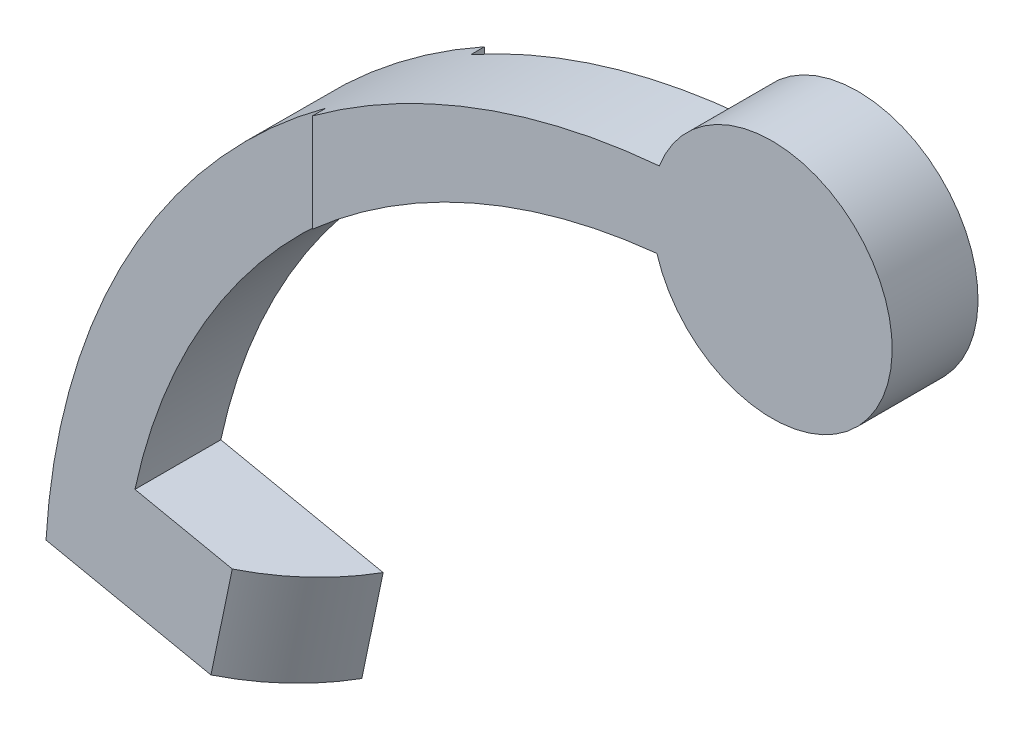
ISO-10303-21;
HEADER;
FILE_DESCRIPTION(('STEP AP214'),'2;1');
FILE_NAME('part.step','',(''),(''),'','','');
FILE_SCHEMA(('AUTOMOTIVE_DESIGN { 1 0 10303 214 1 1 1 1 }'));
ENDSEC;
DATA;
#1=APPLICATION_CONTEXT('core data for automotive mechanical design processes');
#2=APPLICATION_PROTOCOL_DEFINITION('international standard','automotive_design',2000,#1);
#3=PRODUCT_CONTEXT('',#1,'mechanical');
#4=PRODUCT('Part','Part','',(#3));
#5=PRODUCT_RELATED_PRODUCT_CATEGORY('part','',(#4));
#6=PRODUCT_DEFINITION_FORMATION('','',#4);
#7=PRODUCT_DEFINITION_CONTEXT('part definition',#1,'design');
#8=PRODUCT_DEFINITION('design','',#6,#7);
#9=PRODUCT_DEFINITION_SHAPE('','',#8);
#10=(LENGTH_UNIT() NAMED_UNIT(*) SI_UNIT(.MILLI.,.METRE.));
#11=(NAMED_UNIT(*) PLANE_ANGLE_UNIT() SI_UNIT($,.RADIAN.));
#12=(NAMED_UNIT(*) SI_UNIT($,.STERADIAN.) SOLID_ANGLE_UNIT());
#13=UNCERTAINTY_MEASURE_WITH_UNIT(LENGTH_MEASURE(1.E-05),#10,'distance_accuracy_value','');
#14=(GEOMETRIC_REPRESENTATION_CONTEXT(3) GLOBAL_UNCERTAINTY_ASSIGNED_CONTEXT((#13)) GLOBAL_UNIT_ASSIGNED_CONTEXT((#10,
#11,#12)) REPRESENTATION_CONTEXT('',''));
#15=CARTESIAN_POINT('',(0.,0.,0.));
#16=DIRECTION('',(0.,0.,1.));
#17=DIRECTION('',(1.,0.,0.));
#18=AXIS2_PLACEMENT_3D('',#15,#16,#17);
#19=CARTESIAN_POINT('',(-7.54083786418247,-36.2290461115529,45.));
#20=DIRECTION('',(-0.203776064234001,-0.979017525708963,0.));
#21=DIRECTION('',(0.979017525708963,-0.203776064234001,0.));
#22=AXIS2_PLACEMENT_3D('',#19,#20,#21);
#23=PLANE('',#22);
#24=CARTESIAN_POINT('',(-40.2891880374503,-29.4126922330737,-6.16529059894186));
#25=DIRECTION('',(0.203776064234001,0.979017525708963,0.));
#26=DIRECTION('',(-0.979017525708963,0.203776064234001,0.));
#27=AXIS2_PLACEMENT_3D('',#24,#25,#26);
#28=CIRCLE('',#27,13.2527069667015);
#29=CARTESIAN_POINT('',(-32.2142156380667,-31.0934446722632,4.20795064633006));
#30=VERTEX_POINT('',#29);
#31=CARTESIAN_POINT('',(-28.4288232400276,-31.8813492237114,-0.792049353669941));
#32=VERTEX_POINT('',#31);
#33=EDGE_CURVE('E49',#30,#32,#28,.T.);
#34=ORIENTED_EDGE('',*,*,#33,.T.);
#35=DIRECTION('',(0.979017525708963,-0.203776064234001,0.));
#36=VECTOR('',#35,1.);
#37=CARTESIAN_POINT('',(-7.54083786418247,-36.2290461115529,-0.792049353669944));
#38=LINE('',#37,#36);
#39=CARTESIAN_POINT('',(-37.8809726052462,-29.9139464493828,-0.792049353669944));
#40=VERTEX_POINT('',#39);
#41=EDGE_CURVE('E150',#40,#32,#38,.T.);
#42=ORIENTED_EDGE('',*,*,#41,.F.);
#43=DIRECTION('',(0.,0.,-1.));
#44=VECTOR('',#43,1.);
#45=CARTESIAN_POINT('',(-37.8809726052462,-29.9139464493828,45.));
#46=LINE('',#45,#44);
#47=CARTESIAN_POINT('',(-37.8809726052462,-29.9139464493828,4.20795064633006));
#48=VERTEX_POINT('',#47);
#49=EDGE_CURVE('E167',#48,#40,#46,.T.);
#50=ORIENTED_EDGE('',*,*,#49,.F.);
#51=DIRECTION('',(0.979017525708963,-0.203776064234001,0.));
#52=VECTOR('',#51,1.);
#53=CARTESIAN_POINT('',(-7.54083786418247,-36.2290461115529,4.20795064633006));
#54=LINE('',#53,#52);
#55=EDGE_CURVE('E139',#48,#30,#54,.T.);
#56=ORIENTED_EDGE('',*,*,#55,.T.);
#57=EDGE_LOOP('',(#34,#42,#50,#56));
#58=FACE_BOUND('',#57,.T.);
#59=ADVANCED_FACE('F35',(#58),#23,.F.);
#60=CARTESIAN_POINT('',(-8.78245143456309,-42.1942287748356,45.));
#61=DIRECTION('',(0.203776064234002,0.979017525708963,0.));
#62=DIRECTION('',(-0.979017525708963,0.203776064234002,0.));
#63=AXIS2_PLACEMENT_3D('',#60,#61,#62);
#64=PLANE('',#63);
#65=CARTESIAN_POINT('',(-41.5308016078308,-35.3778748963563,-6.16529059894186));
#66=DIRECTION('',(0.203776064234002,0.979017525708963,0.));
#67=DIRECTION('',(-0.979017525708963,0.203776064234002,0.));
#68=AXIS2_PLACEMENT_3D('',#65,#66,#67);
#69=CIRCLE('',#68,13.2527069667015);
#70=CARTESIAN_POINT('',(-33.4558292084473,-37.0586273355458,4.20795064633006));
#71=VERTEX_POINT('',#70);
#72=CARTESIAN_POINT('',(-29.6704368104082,-37.8465318869941,-0.792049353669941));
#73=VERTEX_POINT('',#72);
#74=EDGE_CURVE('E128',#71,#73,#69,.T.);
#75=ORIENTED_EDGE('',*,*,#74,.F.);
#76=DIRECTION('',(-0.979017525708963,0.203776064234002,0.));
#77=VECTOR('',#76,1.);
#78=CARTESIAN_POINT('',(-8.78245143456308,-42.1942287748356,4.20795064633006));
#79=LINE('',#78,#77);
#80=CARTESIAN_POINT('',(-43.0597148745306,-35.0596416473472,4.20795064633006));
#81=VERTEX_POINT('',#80);
#82=EDGE_CURVE('E187',#71,#81,#79,.T.);
#83=ORIENTED_EDGE('',*,*,#82,.T.);
#84=DIRECTION('',(0.,0.,-1.));
#85=VECTOR('',#84,1.);
#86=CARTESIAN_POINT('',(-43.0597148745306,-35.0596416473472,45.));
#87=LINE('',#86,#85);
#88=CARTESIAN_POINT('',(-43.0597148745306,-35.0596416473472,-0.792049353669942));
#89=VERTEX_POINT('',#88);
#90=EDGE_CURVE('E117',#81,#89,#87,.T.);
#91=ORIENTED_EDGE('',*,*,#90,.T.);
#92=DIRECTION('',(-0.979017525708963,0.203776064234002,0.));
#93=VECTOR('',#92,1.);
#94=CARTESIAN_POINT('',(-8.78245143456309,-42.1942287748356,-0.792049353669944));
#95=LINE('',#94,#93);
#96=EDGE_CURVE('E145',#73,#89,#95,.T.);
#97=ORIENTED_EDGE('',*,*,#96,.F.);
#98=EDGE_LOOP('',(#75,#83,#91,#97));
#99=FACE_BOUND('',#98,.T.);
#100=ADVANCED_FACE('F220',(#99),#64,.F.);
#101=CARTESIAN_POINT('',(0.,-37.8465318869941,4.20795064633006));
#102=DIRECTION('',(0.,0.,-1.));
#103=DIRECTION('',(-1.,0.,0.));
#104=AXIS2_PLACEMENT_3D('',#101,#102,#103);
#105=PLANE('',#104);
#106=DIRECTION('',(0.203776064234001,0.979017525708963,0.));
#107=VECTOR('',#106,1.);
#108=CARTESIAN_POINT('',(-34.0118147537973,-39.7297928376601,4.20795064633006));
#109=LINE('',#108,#107);
#110=EDGE_CURVE('E11',#30,#71,#109,.F.);
#111=ORIENTED_EDGE('',*,*,#110,.F.);
#112=ORIENTED_EDGE('',*,*,#55,.F.);
#113=CARTESIAN_POINT('',(-3.12824808202929,-37.4001458236651,4.20795064633006));
#114=DIRECTION('',(0.,0.,-1.));
#115=DIRECTION('',(-1.,0.,0.));
#116=AXIS2_PLACEMENT_3D('',#113,#114,#115);
#117=CIRCLE('',#116,35.5498951173995);
#118=CARTESIAN_POINT('',(-26.7522213143074,-10.8350760594294,4.20795064633006));
#119=VERTEX_POINT('',#118);
#120=EDGE_CURVE('E134',#119,#48,#117,.F.);
#121=ORIENTED_EDGE('',*,*,#120,.F.);
#122=DIRECTION('',(0.,1.,0.));
#123=VECTOR('',#122,1.);
#124=CARTESIAN_POINT('',(-26.7522213143074,-37.8465318869941,4.20795064633006));
#125=LINE('',#124,#123);
#126=CARTESIAN_POINT('',(-26.7522213143074,-5.12154782560139,4.20795064633006));
#127=VERTEX_POINT('',#126);
#128=EDGE_CURVE('E127',#119,#127,#125,.T.);
#129=ORIENTED_EDGE('',*,*,#128,.T.);
#130=CARTESIAN_POINT('',(-3.12824808202929,-37.4001458236651,4.20795064633006));
#131=DIRECTION('',(0.,0.,-1.));
#132=DIRECTION('',(-1.,0.,0.));
#133=AXIS2_PLACEMENT_3D('',#130,#131,#132);
#134=CIRCLE('',#133,40.);
#135=EDGE_CURVE('E183',#81,#127,#134,.T.);
#136=ORIENTED_EDGE('',*,*,#135,.F.);
#137=ORIENTED_EDGE('',*,*,#82,.F.);
#138=EDGE_LOOP('',(#111,#112,#121,#129,#136,#137));
#139=FACE_BOUND('',#138,.T.);
#140=ADVANCED_FACE('F185',(#139),#105,.F.);
#141=CARTESIAN_POINT('',(-3.12824808202929,-37.4001458236651,45.));
#142=DIRECTION('',(0.,0.,-1.));
#143=DIRECTION('',(-1.,0.,0.));
#144=AXIS2_PLACEMENT_3D('',#141,#142,#143);
#145=CYLINDRICAL_SURFACE('',#144,35.5498951173995);
#146=CARTESIAN_POINT('',(-3.12824808202929,-37.4001458236651,5.));
#147=DIRECTION('',(0.,0.,-1.));
#148=DIRECTION('',(-1.,0.,0.));
#149=AXIS2_PLACEMENT_3D('',#146,#147,#148);
#150=CIRCLE('',#149,35.5498951173995);
#151=CARTESIAN_POINT('',(-6.69917083103431,-2.0300517669801,5.));
#152=VERTEX_POINT('',#151);
#153=CARTESIAN_POINT('',(-26.7522213143074,-10.8350760594294,4.99999999999991));
#154=VERTEX_POINT('',#153);
#155=EDGE_CURVE('E57',#152,#154,#150,.F.);
#156=ORIENTED_EDGE('',*,*,#155,.T.);
#157=DIRECTION('',(0.,0.,-1.));
#158=VECTOR('',#157,1.);
#159=CARTESIAN_POINT('',(-26.7522213143074,-10.8350760594294,45.));
#160=LINE('',#159,#158);
#161=EDGE_CURVE('E114',#154,#119,#160,.T.);
#162=ORIENTED_EDGE('',*,*,#161,.T.);
#163=ORIENTED_EDGE('',*,*,#120,.T.);
#164=ORIENTED_EDGE('',*,*,#49,.T.);
#165=CARTESIAN_POINT('',(-3.12824808202929,-37.4001458236651,-0.792049353669944));
#166=DIRECTION('',(0.,0.,-1.));
#167=DIRECTION('',(-1.,0.,0.));
#168=AXIS2_PLACEMENT_3D('',#165,#166,#167);
#169=CIRCLE('',#168,35.5498951173995);
#170=CARTESIAN_POINT('',(-22.5349055214412,-7.6146344148035,-0.792049353669941));
#171=VERTEX_POINT('',#170);
#172=EDGE_CURVE('E153',#171,#40,#169,.F.);
#173=ORIENTED_EDGE('',*,*,#172,.F.);
#174=DIRECTION('',(0.,0.,-1.));
#175=VECTOR('',#174,1.);
#176=CARTESIAN_POINT('',(-22.5349055214412,-7.6146344148035,45.));
#177=LINE('',#176,#175);
#178=CARTESIAN_POINT('',(-22.5349055214412,-7.6146344148035,0.));
#179=VERTEX_POINT('',#178);
#180=EDGE_CURVE('E118',#179,#171,#177,.T.);
#181=ORIENTED_EDGE('',*,*,#180,.F.);
#182=CARTESIAN_POINT('',(-3.12824808202929,-37.4001458236651,0.));
#183=DIRECTION('',(0.,0.,-1.));
#184=DIRECTION('',(-1.,0.,0.));
#185=AXIS2_PLACEMENT_3D('',#182,#183,#184);
#186=CIRCLE('',#185,35.5498951173995);
#187=CARTESIAN_POINT('',(-6.69917083103431,-2.0300517669801,0.));
#188=VERTEX_POINT('',#187);
#189=EDGE_CURVE('E159',#188,#179,#186,.F.);
#190=ORIENTED_EDGE('',*,*,#189,.F.);
#191=DIRECTION('',(0.,0.,-1.));
#192=VECTOR('',#191,1.);
#193=CARTESIAN_POINT('',(-6.69917083103431,-2.0300517669801,45.));
#194=LINE('',#193,#192);
#195=EDGE_CURVE('E116',#152,#188,#194,.T.);
#196=ORIENTED_EDGE('',*,*,#195,.F.);
#197=EDGE_LOOP('',(#156,#162,#163,#164,#173,#181,#190,#196));
#198=FACE_BOUND('',#197,.T.);
#199=ADVANCED_FACE('F111',(#198),#145,.F.);
#200=CARTESIAN_POINT('',(-3.12824808202929,-37.4001458236651,45.));
#201=DIRECTION('',(0.,0.,-1.));
#202=DIRECTION('',(-1.,0.,0.));
#203=AXIS2_PLACEMENT_3D('',#200,#201,#202);
#204=CYLINDRICAL_SURFACE('',#203,40.);
#205=DIRECTION('',(0.,0.,-1.));
#206=VECTOR('',#205,1.);
#207=CARTESIAN_POINT('',(-26.7522213143074,-5.12154782560139,45.));
#208=LINE('',#207,#206);
#209=CARTESIAN_POINT('',(-26.7522213143074,-5.12154782560138,5.));
#210=VERTEX_POINT('',#209);
#211=EDGE_CURVE('E43',#127,#210,#208,.F.);
#212=ORIENTED_EDGE('',*,*,#211,.T.);
#213=CARTESIAN_POINT('',(-3.12824808202929,-37.4001458236651,5.));
#214=DIRECTION('',(0.,0.,-1.));
#215=DIRECTION('',(-1.,0.,0.));
#216=AXIS2_PLACEMENT_3D('',#213,#214,#215);
#217=CIRCLE('',#216,40.);
#218=CARTESIAN_POINT('',(-6.55624058274921,2.45269431872631,5.));
#219=VERTEX_POINT('',#218);
#220=EDGE_CURVE('E124',#210,#219,#217,.T.);
#221=ORIENTED_EDGE('',*,*,#220,.T.);
#222=DIRECTION('',(0.,0.,-1.));
#223=VECTOR('',#222,1.);
#224=CARTESIAN_POINT('',(-6.55624058274921,2.45269431872632,45.));
#225=LINE('',#224,#223);
#226=CARTESIAN_POINT('',(-6.55624058274921,2.4526943187263,0.));
#227=VERTEX_POINT('',#226);
#228=EDGE_CURVE('E163',#219,#227,#225,.T.);
#229=ORIENTED_EDGE('',*,*,#228,.T.);
#230=CARTESIAN_POINT('',(-3.12824808202929,-37.4001458236651,0.));
#231=DIRECTION('',(0.,0.,-1.));
#232=DIRECTION('',(-1.,0.,0.));
#233=AXIS2_PLACEMENT_3D('',#230,#231,#232);
#234=CIRCLE('',#233,40.);
#235=CARTESIAN_POINT('',(-22.5349055214412,-2.42327279262763,0.));
#236=VERTEX_POINT('',#235);
#237=EDGE_CURVE('E156',#236,#227,#234,.T.);
#238=ORIENTED_EDGE('',*,*,#237,.F.);
#239=DIRECTION('',(0.,0.,-1.));
#240=VECTOR('',#239,1.);
#241=CARTESIAN_POINT('',(-22.5349055214412,-2.42327279262763,45.));
#242=LINE('',#241,#240);
#243=CARTESIAN_POINT('',(-22.5349055214412,-2.42327279262763,-0.792049353669941));
#244=VERTEX_POINT('',#243);
#245=EDGE_CURVE('E176',#244,#236,#242,.F.);
#246=ORIENTED_EDGE('',*,*,#245,.F.);
#247=CARTESIAN_POINT('',(-3.12824808202929,-37.4001458236651,-0.792049353669944));
#248=DIRECTION('',(0.,0.,-1.));
#249=DIRECTION('',(-1.,0.,0.));
#250=AXIS2_PLACEMENT_3D('',#247,#248,#249);
#251=CIRCLE('',#250,40.);
#252=EDGE_CURVE('E148',#89,#244,#251,.T.);
#253=ORIENTED_EDGE('',*,*,#252,.F.);
#254=ORIENTED_EDGE('',*,*,#90,.F.);
#255=ORIENTED_EDGE('',*,*,#135,.T.);
#256=EDGE_LOOP('',(#212,#221,#229,#238,#246,#253,#254,#255));
#257=FACE_BOUND('',#256,.T.);
#258=ADVANCED_FACE('F179',(#257),#204,.T.);
#259=CARTESIAN_POINT('',(0.,0.,0.));
#260=DIRECTION('',(0.,0.,1.));
#261=DIRECTION('',(1.,0.,0.));
#262=AXIS2_PLACEMENT_3D('',#259,#260,#261);
#263=PLANE('',#262);
#264=ORIENTED_EDGE('',*,*,#237,.T.);
#265=CARTESIAN_POINT('',(0.,0.,0.));
#266=DIRECTION('',(0.,0.,1.));
#267=DIRECTION('',(1.,0.,0.));
#268=AXIS2_PLACEMENT_3D('',#265,#266,#267);
#269=CIRCLE('',#268,7.);
#270=EDGE_CURVE('E169',#188,#227,#269,.T.);
#271=ORIENTED_EDGE('',*,*,#270,.F.);
#272=ORIENTED_EDGE('',*,*,#189,.T.);
#273=DIRECTION('',(0.,-1.,0.));
#274=VECTOR('',#273,1.);
#275=CARTESIAN_POINT('',(-22.5349055214412,5.,0.));
#276=LINE('',#275,#274);
#277=EDGE_CURVE('E133',#236,#179,#276,.T.);
#278=ORIENTED_EDGE('',*,*,#277,.F.);
#279=EDGE_LOOP('',(#264,#271,#272,#278));
#280=FACE_BOUND('',#279,.T.);
#281=ADVANCED_FACE('F211',(#280),#263,.F.);
#282=CARTESIAN_POINT('',(0.,0.,5.));
#283=DIRECTION('',(0.,0.,-1.));
#284=DIRECTION('',(-1.,0.,0.));
#285=AXIS2_PLACEMENT_3D('',#282,#283,#284);
#286=CYLINDRICAL_SURFACE('',#285,7.);
#287=ORIENTED_EDGE('',*,*,#195,.T.);
#288=ORIENTED_EDGE('',*,*,#270,.T.);
#289=ORIENTED_EDGE('',*,*,#228,.F.);
#290=CARTESIAN_POINT('',(0.,0.,5.));
#291=DIRECTION('',(0.,0.,1.));
#292=DIRECTION('',(1.,0.,0.));
#293=AXIS2_PLACEMENT_3D('',#290,#291,#292);
#294=CIRCLE('',#293,7.);
#295=EDGE_CURVE('E170',#152,#219,#294,.T.);
#296=ORIENTED_EDGE('',*,*,#295,.F.);
#297=EDGE_LOOP('',(#287,#288,#289,#296));
#298=FACE_BOUND('',#297,.T.);
#299=ADVANCED_FACE('F37',(#298),#286,.T.);
#300=CARTESIAN_POINT('',(0.,0.,5.));
#301=DIRECTION('',(0.,0.,1.));
#302=DIRECTION('',(1.,0.,0.));
#303=AXIS2_PLACEMENT_3D('',#300,#301,#302);
#304=PLANE('',#303);
#305=ORIENTED_EDGE('',*,*,#295,.T.);
#306=ORIENTED_EDGE('',*,*,#220,.F.);
#307=DIRECTION('',(0.,1.,0.));
#308=VECTOR('',#307,1.);
#309=CARTESIAN_POINT('',(-26.7522213143074,-37.8465318869941,5.));
#310=LINE('',#309,#308);
#311=EDGE_CURVE('E121',#154,#210,#310,.T.);
#312=ORIENTED_EDGE('',*,*,#311,.F.);
#313=ORIENTED_EDGE('',*,*,#155,.F.);
#314=EDGE_LOOP('',(#305,#306,#312,#313));
#315=FACE_BOUND('',#314,.T.);
#316=ADVANCED_FACE('F122',(#315),#304,.T.);
#317=CARTESIAN_POINT('',(-22.5349055214412,5.,5.));
#318=DIRECTION('',(1.,0.,0.));
#319=DIRECTION('',(0.,0.,-1.));
#320=AXIS2_PLACEMENT_3D('',#317,#318,#319);
#321=PLANE('',#320);
#322=ORIENTED_EDGE('',*,*,#180,.T.);
#323=DIRECTION('',(0.,-1.,0.));
#324=VECTOR('',#323,1.);
#325=CARTESIAN_POINT('',(-22.5349055214412,5.,-0.792049353669941));
#326=LINE('',#325,#324);
#327=EDGE_CURVE('E137',#244,#171,#326,.T.);
#328=ORIENTED_EDGE('',*,*,#327,.F.);
#329=ORIENTED_EDGE('',*,*,#245,.T.);
#330=ORIENTED_EDGE('',*,*,#277,.T.);
#331=EDGE_LOOP('',(#322,#328,#329,#330));
#332=FACE_BOUND('',#331,.T.);
#333=ADVANCED_FACE('F206',(#332),#321,.T.);
#334=CARTESIAN_POINT('',(0.,5.,-0.792049353669941));
#335=DIRECTION('',(0.,0.,-1.));
#336=DIRECTION('',(-1.,0.,0.));
#337=AXIS2_PLACEMENT_3D('',#334,#335,#336);
#338=PLANE('',#337);
#339=ORIENTED_EDGE('',*,*,#172,.T.);
#340=ORIENTED_EDGE('',*,*,#41,.T.);
#341=DIRECTION('',(0.203776064234001,0.979017525708963,0.));
#342=VECTOR('',#341,1.);
#343=CARTESIAN_POINT('',(-20.8879853758451,4.34769688784146,-0.792049353669944));
#344=LINE('',#343,#342);
#345=EDGE_CURVE('E174',#73,#32,#344,.T.);
#346=ORIENTED_EDGE('',*,*,#345,.F.);
#347=ORIENTED_EDGE('',*,*,#96,.T.);
#348=ORIENTED_EDGE('',*,*,#252,.T.);
#349=ORIENTED_EDGE('',*,*,#327,.T.);
#350=EDGE_LOOP('',(#339,#340,#346,#347,#348,#349));
#351=FACE_BOUND('',#350,.T.);
#352=ADVANCED_FACE('F200',(#351),#338,.T.);
#353=CARTESIAN_POINT('',(-26.7522213143074,-37.8465318869941,5.));
#354=DIRECTION('',(1.,0.,0.));
#355=DIRECTION('',(0.,0.,-1.));
#356=AXIS2_PLACEMENT_3D('',#353,#354,#355);
#357=PLANE('',#356);
#358=ORIENTED_EDGE('',*,*,#311,.T.);
#359=ORIENTED_EDGE('',*,*,#211,.F.);
#360=ORIENTED_EDGE('',*,*,#128,.F.);
#361=ORIENTED_EDGE('',*,*,#161,.F.);
#362=EDGE_LOOP('',(#358,#359,#360,#361));
#363=FACE_BOUND('',#362,.T.);
#364=ADVANCED_FACE('F131',(#363),#357,.F.);
#365=CARTESIAN_POINT('',(-42.0867871531808,-38.0490403984707,-6.16529059894186));
#366=DIRECTION('',(0.203776064234001,0.979017525708963,0.));
#367=DIRECTION('',(-0.979017525708963,0.203776064234001,0.));
#368=AXIS2_PLACEMENT_3D('',#365,#366,#367);
#369=CYLINDRICAL_SURFACE('',#368,13.2527069667015);
#370=ORIENTED_EDGE('',*,*,#74,.T.);
#371=ORIENTED_EDGE('',*,*,#345,.T.);
#372=ORIENTED_EDGE('',*,*,#33,.F.);
#373=ORIENTED_EDGE('',*,*,#110,.T.);
#374=EDGE_LOOP('',(#370,#371,#372,#373));
#375=FACE_BOUND('',#374,.T.);
#376=ADVANCED_FACE('F240',(#375),#369,.T.);
#377=CLOSED_SHELL('',(#59,#100,#140,#199,#258,#281,#299,#316,#333,#352,#364,#376));
#378=MANIFOLD_SOLID_BREP('B2',#377);
#379=ADVANCED_BREP_SHAPE_REPRESENTATION('',(#18,#378),#14);
#380=SHAPE_DEFINITION_REPRESENTATION(#9,#379);
ENDSEC;
END-ISO-10303-21;
